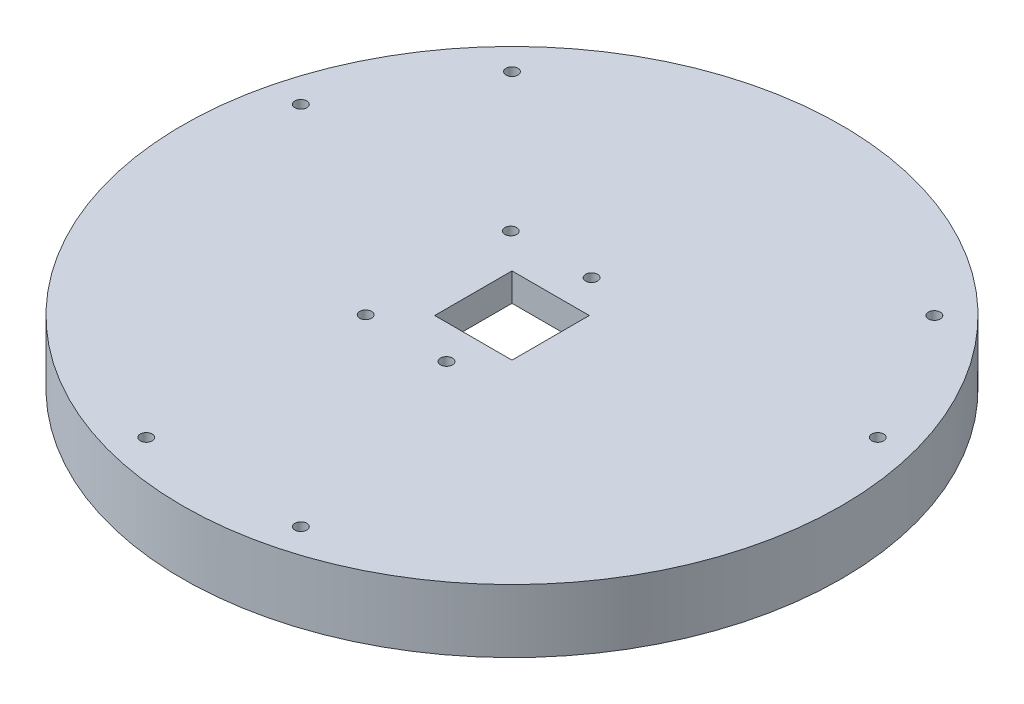
ISO-10303-21;
HEADER;
FILE_DESCRIPTION(('STEP AP214'),'2;1');
FILE_NAME('part.step','',(''),(''),'','','');
FILE_SCHEMA(('AUTOMOTIVE_DESIGN { 1 0 10303 214 1 1 1 1 }'));
ENDSEC;
DATA;
#1=APPLICATION_CONTEXT('core data for automotive mechanical design processes');
#2=APPLICATION_PROTOCOL_DEFINITION('international standard','automotive_design',2000,#1);
#3=PRODUCT_CONTEXT('',#1,'mechanical');
#4=PRODUCT('Part','Part','',(#3));
#5=PRODUCT_RELATED_PRODUCT_CATEGORY('part','',(#4));
#6=PRODUCT_DEFINITION_FORMATION('','',#4);
#7=PRODUCT_DEFINITION_CONTEXT('part definition',#1,'design');
#8=PRODUCT_DEFINITION('design','',#6,#7);
#9=PRODUCT_DEFINITION_SHAPE('','',#8);
#10=(LENGTH_UNIT() NAMED_UNIT(*) SI_UNIT(.MILLI.,.METRE.));
#11=(NAMED_UNIT(*) PLANE_ANGLE_UNIT() SI_UNIT($,.RADIAN.));
#12=(NAMED_UNIT(*) SI_UNIT($,.STERADIAN.) SOLID_ANGLE_UNIT());
#13=UNCERTAINTY_MEASURE_WITH_UNIT(LENGTH_MEASURE(1.E-05),#10,'distance_accuracy_value','');
#14=(GEOMETRIC_REPRESENTATION_CONTEXT(3) GLOBAL_UNCERTAINTY_ASSIGNED_CONTEXT((#13)) GLOBAL_UNIT_ASSIGNED_CONTEXT((#10,
#11,#12)) REPRESENTATION_CONTEXT('',''));
#15=CARTESIAN_POINT('',(0.,0.,0.));
#16=DIRECTION('',(0.,0.,1.));
#17=DIRECTION('',(1.,0.,0.));
#18=AXIS2_PLACEMENT_3D('',#15,#16,#17);
#19=CARTESIAN_POINT('',(0.,5.,0.));
#20=DIRECTION('',(0.,1.,0.));
#21=DIRECTION('',(0.,0.,1.));
#22=AXIS2_PLACEMENT_3D('',#19,#20,#21);
#23=PLANE('',#22);
#24=DIRECTION('',(0.,0.,1.));
#25=VECTOR('',#24,1.);
#26=CARTESIAN_POINT('',(21.4884157050371,5.,0.));
#27=LINE('',#26,#25);
#28=CARTESIAN_POINT('',(21.4884157050371,5.,33.7379310344827));
#29=VERTEX_POINT('',#28);
#30=CARTESIAN_POINT('',(21.4884157050371,5.,39.5379310344827));
#31=VERTEX_POINT('',#30);
#32=EDGE_CURVE('E141',#29,#31,#27,.T.);
#33=ORIENTED_EDGE('',*,*,#32,.F.);
#34=CARTESIAN_POINT('',(0.,5.,0.));
#35=DIRECTION('',(0.,-1.,0.));
#36=DIRECTION('',(0.,0.,-1.));
#37=AXIS2_PLACEMENT_3D('',#34,#35,#36);
#38=CIRCLE('',#37,40.);
#39=CARTESIAN_POINT('',(17.668302265885,5.,35.8863636363636));
#40=VERTEX_POINT('',#39);
#41=EDGE_CURVE('E137',#29,#40,#38,.T.);
#42=ORIENTED_EDGE('',*,*,#41,.T.);
#43=DIRECTION('',(0.,0.,1.));
#44=VECTOR('',#43,1.);
#45=CARTESIAN_POINT('',(17.668302265885,5.,0.));
#46=LINE('',#45,#44);
#47=CARTESIAN_POINT('',(17.668302265885,5.,41.3863636363636));
#48=VERTEX_POINT('',#47);
#49=EDGE_CURVE('E67',#40,#48,#46,.T.);
#50=ORIENTED_EDGE('',*,*,#49,.T.);
#51=CARTESIAN_POINT('',(0.,5.,0.));
#52=DIRECTION('',(0.,-1.,0.));
#53=DIRECTION('',(0.,0.,-1.));
#54=AXIS2_PLACEMENT_3D('',#51,#52,#53);
#55=CIRCLE('',#54,45.);
#56=EDGE_CURVE('E564',#31,#48,#55,.T.);
#57=ORIENTED_EDGE('',*,*,#56,.F.);
#58=EDGE_LOOP('',(#33,#42,#50,#57));
#59=FACE_BOUND('',#58,.T.);
#60=CARTESIAN_POINT('',(-41.0518476172854,5.,-10.9998094168573));
#61=DIRECTION('',(0.,1.,0.));
#62=DIRECTION('',(0.,0.,1.));
#63=AXIS2_PLACEMENT_3D('',#60,#61,#62);
#64=CIRCLE('',#63,0.850000000000011);
#65=CARTESIAN_POINT('',(-41.0518476172854,5.,-10.1498094168573));
#66=VERTEX_POINT('',#65);
#67=EDGE_CURVE('E146',#66,#66,#64,.T.);
#68=ORIENTED_EDGE('',*,*,#67,.T.);
#69=EDGE_LOOP('',(#68));
#70=FACE_BOUND('',#69,.T.);
#71=CARTESIAN_POINT('',(-30.0520382004281,5.,-30.0520382004284));
#72=DIRECTION('',(0.,1.,0.));
#73=DIRECTION('',(0.,0.,1.));
#74=AXIS2_PLACEMENT_3D('',#71,#72,#73);
#75=CIRCLE('',#74,0.850000000000014);
#76=CARTESIAN_POINT('',(-30.0520382004281,5.,-29.2020382004284));
#77=VERTEX_POINT('',#76);
#78=EDGE_CURVE('E157',#77,#77,#75,.T.);
#79=ORIENTED_EDGE('',*,*,#78,.T.);
#80=EDGE_LOOP('',(#79));
#81=FACE_BOUND('',#80,.T.);
#82=CARTESIAN_POINT('',(30.0520382004285,5.,-30.052038200428));
#83=DIRECTION('',(0.,1.,0.));
#84=DIRECTION('',(0.,0.,1.));
#85=AXIS2_PLACEMENT_3D('',#82,#83,#84);
#86=CIRCLE('',#85,0.850000000000014);
#87=CARTESIAN_POINT('',(30.0520382004285,5.,-29.202038200428));
#88=VERTEX_POINT('',#87);
#89=EDGE_CURVE('E163',#88,#88,#86,.T.);
#90=ORIENTED_EDGE('',*,*,#89,.T.);
#91=EDGE_LOOP('',(#90));
#92=FACE_BOUND('',#91,.T.);
#93=CARTESIAN_POINT('',(41.0518476172855,5.,-10.9998094168567));
#94=DIRECTION('',(0.,1.,0.));
#95=DIRECTION('',(0.,0.,1.));
#96=AXIS2_PLACEMENT_3D('',#93,#94,#95);
#97=CIRCLE('',#96,0.850000000000011);
#98=CARTESIAN_POINT('',(41.0518476172855,5.,-10.1498094168567));
#99=VERTEX_POINT('',#98);
#100=EDGE_CURVE('E169',#99,#99,#97,.T.);
#101=ORIENTED_EDGE('',*,*,#100,.T.);
#102=EDGE_LOOP('',(#101));
#103=FACE_BOUND('',#102,.T.);
#104=CARTESIAN_POINT('',(10.9998094168572,5.,41.0518476172854));
#105=DIRECTION('',(0.,1.,0.));
#106=DIRECTION('',(0.,0.,1.));
#107=AXIS2_PLACEMENT_3D('',#104,#105,#106);
#108=CIRCLE('',#107,0.850000000000013);
#109=CARTESIAN_POINT('',(10.9998094168572,5.,41.9018476172854));
#110=VERTEX_POINT('',#109);
#111=EDGE_CURVE('E175',#110,#110,#108,.T.);
#112=ORIENTED_EDGE('',*,*,#111,.T.);
#113=EDGE_LOOP('',(#112));
#114=FACE_BOUND('',#113,.T.);
#115=CARTESIAN_POINT('',(-10.9998094168572,5.,41.0518476172854));
#116=DIRECTION('',(0.,1.,0.));
#117=DIRECTION('',(0.,0.,1.));
#118=AXIS2_PLACEMENT_3D('',#115,#116,#117);
#119=CIRCLE('',#118,0.850000000000013);
#120=CARTESIAN_POINT('',(-10.9998094168572,5.,41.9018476172854));
#121=VERTEX_POINT('',#120);
#122=EDGE_CURVE('E181',#121,#121,#119,.T.);
#123=ORIENTED_EDGE('',*,*,#122,.T.);
#124=EDGE_LOOP('',(#123));
#125=FACE_BOUND('',#124,.T.);
#126=CARTESIAN_POINT('',(0.999999999999999,5.,-10.3260869565217));
#127=DIRECTION('',(0.,-1.,0.));
#128=DIRECTION('',(0.,0.,-1.));
#129=AXIS2_PLACEMENT_3D('',#126,#127,#128);
#130=CIRCLE('',#129,0.850000000000013);
#131=CARTESIAN_POINT('',(0.999999999999999,5.,-11.1760869565218));
#132=VERTEX_POINT('',#131);
#133=EDGE_CURVE('E184',#132,#132,#130,.T.);
#134=ORIENTED_EDGE('',*,*,#133,.F.);
#135=EDGE_LOOP('',(#134));
#136=FACE_BOUND('',#135,.T.);
#137=CARTESIAN_POINT('',(-10.5,5.,-10.3260869565217));
#138=DIRECTION('',(0.,-1.,0.));
#139=DIRECTION('',(0.,0.,-1.));
#140=AXIS2_PLACEMENT_3D('',#137,#138,#139);
#141=CIRCLE('',#140,0.850000000000014);
#142=CARTESIAN_POINT('',(-10.5,5.,-11.1760869565218));
#143=VERTEX_POINT('',#142);
#144=EDGE_CURVE('E190',#143,#143,#141,.T.);
#145=ORIENTED_EDGE('',*,*,#144,.F.);
#146=EDGE_LOOP('',(#145));
#147=FACE_BOUND('',#146,.T.);
#148=CARTESIAN_POINT('',(-10.5,5.,10.3260869565217));
#149=DIRECTION('',(0.,-1.,0.));
#150=DIRECTION('',(0.,0.,-1.));
#151=AXIS2_PLACEMENT_3D('',#148,#149,#150);
#152=CIRCLE('',#151,0.850000000000014);
#153=CARTESIAN_POINT('',(-10.5,5.,9.47608695652172));
#154=VERTEX_POINT('',#153);
#155=EDGE_CURVE('E196',#154,#154,#152,.T.);
#156=ORIENTED_EDGE('',*,*,#155,.F.);
#157=EDGE_LOOP('',(#156));
#158=FACE_BOUND('',#157,.T.);
#159=CARTESIAN_POINT('',(0.999999999999996,5.,10.3260869565217));
#160=DIRECTION('',(0.,-1.,0.));
#161=DIRECTION('',(0.,0.,-1.));
#162=AXIS2_PLACEMENT_3D('',#159,#160,#161);
#163=CIRCLE('',#162,0.850000000000013);
#164=CARTESIAN_POINT('',(0.999999999999996,5.,9.47608695652172));
#165=VERTEX_POINT('',#164);
#166=EDGE_CURVE('E200',#165,#165,#163,.T.);
#167=ORIENTED_EDGE('',*,*,#166,.F.);
#168=EDGE_LOOP('',(#167));
#169=FACE_BOUND('',#168,.T.);
#170=CARTESIAN_POINT('',(0.,5.,0.));
#171=DIRECTION('',(0.,1.,0.));
#172=DIRECTION('',(1.,0.,0.));
#173=AXIS2_PLACEMENT_3D('',#170,#171,#172);
#174=CIRCLE('',#173,45.1);
#175=CARTESIAN_POINT('',(45.1,5.,0.));
#176=VERTEX_POINT('',#175);
#177=EDGE_CURVE('E235',#176,#176,#174,.T.);
#178=ORIENTED_EDGE('',*,*,#177,.F.);
#179=EDGE_LOOP('',(#178));
#180=FACE_BOUND('',#179,.T.);
#181=DIRECTION('',(0.,0.,-1.));
#182=VECTOR('',#181,1.);
#183=CARTESIAN_POINT('',(5.5,5.,0.));
#184=LINE('',#183,#182);
#185=CARTESIAN_POINT('',(5.5,5.,5.5));
#186=VERTEX_POINT('',#185);
#187=CARTESIAN_POINT('',(5.5,5.,-5.5));
#188=VERTEX_POINT('',#187);
#189=EDGE_CURVE('E75',#186,#188,#184,.T.);
#190=ORIENTED_EDGE('',*,*,#189,.T.);
#191=DIRECTION('',(1.,0.,0.));
#192=VECTOR('',#191,1.);
#193=CARTESIAN_POINT('',(0.,5.,-5.5));
#194=LINE('',#193,#192);
#195=CARTESIAN_POINT('',(-5.5,5.,-5.5));
#196=VERTEX_POINT('',#195);
#197=EDGE_CURVE('E207',#196,#188,#194,.T.);
#198=ORIENTED_EDGE('',*,*,#197,.F.);
#199=DIRECTION('',(0.,0.,-1.));
#200=VECTOR('',#199,1.);
#201=CARTESIAN_POINT('',(-5.5,5.,0.));
#202=LINE('',#201,#200);
#203=CARTESIAN_POINT('',(-5.5,5.,5.5));
#204=VERTEX_POINT('',#203);
#205=EDGE_CURVE('E220',#204,#196,#202,.T.);
#206=ORIENTED_EDGE('',*,*,#205,.F.);
#207=DIRECTION('',(1.,0.,0.));
#208=VECTOR('',#207,1.);
#209=CARTESIAN_POINT('',(0.,5.,5.5));
#210=LINE('',#209,#208);
#211=EDGE_CURVE('E217',#204,#186,#210,.T.);
#212=ORIENTED_EDGE('',*,*,#211,.T.);
#213=EDGE_LOOP('',(#190,#198,#206,#212));
#214=FACE_BOUND('',#213,.T.);
#215=ADVANCED_FACE('F51',(#59,#70,#81,#92,#103,#114,#125,#136,#147,#158,#169,#180,#214),#23,.F.);
#216=CARTESIAN_POINT('',(0.,9.,0.));
#217=DIRECTION('',(0.,1.,0.));
#218=DIRECTION('',(0.,0.,1.));
#219=AXIS2_PLACEMENT_3D('',#216,#217,#218);
#220=PLANE('',#219);
#221=CARTESIAN_POINT('',(-41.0518476172854,9.,-10.9998094168573));
#222=DIRECTION('',(0.,1.,0.));
#223=DIRECTION('',(0.,0.,1.));
#224=AXIS2_PLACEMENT_3D('',#221,#222,#223);
#225=CIRCLE('',#224,0.850000000000011);
#226=CARTESIAN_POINT('',(-41.0518476172854,9.,-10.1498094168573));
#227=VERTEX_POINT('',#226);
#228=EDGE_CURVE('E143',#227,#227,#225,.T.);
#229=ORIENTED_EDGE('',*,*,#228,.F.);
#230=EDGE_LOOP('',(#229));
#231=FACE_BOUND('',#230,.T.);
#232=CARTESIAN_POINT('',(-30.0520382004281,9.,-30.0520382004284));
#233=DIRECTION('',(0.,1.,0.));
#234=DIRECTION('',(0.,0.,1.));
#235=AXIS2_PLACEMENT_3D('',#232,#233,#234);
#236=CIRCLE('',#235,0.850000000000014);
#237=CARTESIAN_POINT('',(-30.0520382004281,9.,-29.2020382004284));
#238=VERTEX_POINT('',#237);
#239=EDGE_CURVE('E154',#238,#238,#236,.T.);
#240=ORIENTED_EDGE('',*,*,#239,.F.);
#241=EDGE_LOOP('',(#240));
#242=FACE_BOUND('',#241,.T.);
#243=CARTESIAN_POINT('',(30.0520382004285,9.,-30.052038200428));
#244=DIRECTION('',(0.,1.,0.));
#245=DIRECTION('',(0.,0.,1.));
#246=AXIS2_PLACEMENT_3D('',#243,#244,#245);
#247=CIRCLE('',#246,0.850000000000014);
#248=CARTESIAN_POINT('',(30.0520382004285,9.,-29.202038200428));
#249=VERTEX_POINT('',#248);
#250=EDGE_CURVE('E160',#249,#249,#247,.T.);
#251=ORIENTED_EDGE('',*,*,#250,.F.);
#252=EDGE_LOOP('',(#251));
#253=FACE_BOUND('',#252,.T.);
#254=CARTESIAN_POINT('',(41.0518476172855,9.,-10.9998094168567));
#255=DIRECTION('',(0.,1.,0.));
#256=DIRECTION('',(0.,0.,1.));
#257=AXIS2_PLACEMENT_3D('',#254,#255,#256);
#258=CIRCLE('',#257,0.850000000000011);
#259=CARTESIAN_POINT('',(41.0518476172855,9.,-10.1498094168567));
#260=VERTEX_POINT('',#259);
#261=EDGE_CURVE('E166',#260,#260,#258,.T.);
#262=ORIENTED_EDGE('',*,*,#261,.F.);
#263=EDGE_LOOP('',(#262));
#264=FACE_BOUND('',#263,.T.);
#265=CARTESIAN_POINT('',(10.9998094168572,9.,41.0518476172854));
#266=DIRECTION('',(0.,1.,0.));
#267=DIRECTION('',(0.,0.,1.));
#268=AXIS2_PLACEMENT_3D('',#265,#266,#267);
#269=CIRCLE('',#268,0.850000000000014);
#270=CARTESIAN_POINT('',(10.9998094168572,9.,41.9018476172854));
#271=VERTEX_POINT('',#270);
#272=EDGE_CURVE('E172',#271,#271,#269,.T.);
#273=ORIENTED_EDGE('',*,*,#272,.F.);
#274=EDGE_LOOP('',(#273));
#275=FACE_BOUND('',#274,.T.);
#276=CARTESIAN_POINT('',(-10.9998094168572,9.,41.0518476172854));
#277=DIRECTION('',(0.,1.,0.));
#278=DIRECTION('',(0.,0.,1.));
#279=AXIS2_PLACEMENT_3D('',#276,#277,#278);
#280=CIRCLE('',#279,0.850000000000014);
#281=CARTESIAN_POINT('',(-10.9998094168572,9.,41.9018476172854));
#282=VERTEX_POINT('',#281);
#283=EDGE_CURVE('E178',#282,#282,#280,.T.);
#284=ORIENTED_EDGE('',*,*,#283,.F.);
#285=EDGE_LOOP('',(#284));
#286=FACE_BOUND('',#285,.T.);
#287=CARTESIAN_POINT('',(0.999999999999999,9.,-10.3260869565217));
#288=DIRECTION('',(0.,1.,0.));
#289=DIRECTION('',(0.,0.,1.));
#290=AXIS2_PLACEMENT_3D('',#287,#288,#289);
#291=CIRCLE('',#290,0.850000000000013);
#292=CARTESIAN_POINT('',(0.999999999999999,9.,-9.47608695652173));
#293=VERTEX_POINT('',#292);
#294=EDGE_CURVE('E187',#293,#293,#291,.T.);
#295=ORIENTED_EDGE('',*,*,#294,.F.);
#296=EDGE_LOOP('',(#295));
#297=FACE_BOUND('',#296,.T.);
#298=CARTESIAN_POINT('',(-10.5,9.,-10.3260869565217));
#299=DIRECTION('',(0.,1.,0.));
#300=DIRECTION('',(0.,0.,1.));
#301=AXIS2_PLACEMENT_3D('',#298,#299,#300);
#302=CIRCLE('',#301,0.850000000000013);
#303=CARTESIAN_POINT('',(-10.5,9.,-9.47608695652173));
#304=VERTEX_POINT('',#303);
#305=EDGE_CURVE('E193',#304,#304,#302,.T.);
#306=ORIENTED_EDGE('',*,*,#305,.F.);
#307=EDGE_LOOP('',(#306));
#308=FACE_BOUND('',#307,.T.);
#309=CARTESIAN_POINT('',(-10.5,9.,10.3260869565217));
#310=DIRECTION('',(0.,1.,0.));
#311=DIRECTION('',(0.,0.,1.));
#312=AXIS2_PLACEMENT_3D('',#309,#310,#311);
#313=CIRCLE('',#312,0.850000000000013);
#314=CARTESIAN_POINT('',(-10.5,9.,11.1760869565217));
#315=VERTEX_POINT('',#314);
#316=EDGE_CURVE('E199',#315,#315,#313,.T.);
#317=ORIENTED_EDGE('',*,*,#316,.F.);
#318=EDGE_LOOP('',(#317));
#319=FACE_BOUND('',#318,.T.);
#320=CARTESIAN_POINT('',(0.999999999999996,9.,10.3260869565217));
#321=DIRECTION('',(0.,1.,0.));
#322=DIRECTION('',(0.,0.,1.));
#323=AXIS2_PLACEMENT_3D('',#320,#321,#322);
#324=CIRCLE('',#323,0.850000000000013);
#325=CARTESIAN_POINT('',(0.999999999999996,9.,11.1760869565217));
#326=VERTEX_POINT('',#325);
#327=EDGE_CURVE('E203',#326,#326,#324,.T.);
#328=ORIENTED_EDGE('',*,*,#327,.F.);
#329=EDGE_LOOP('',(#328));
#330=FACE_BOUND('',#329,.T.);
#331=CARTESIAN_POINT('',(0.,9.,0.));
#332=DIRECTION('',(0.,1.,0.));
#333=DIRECTION('',(0.,0.,1.));
#334=AXIS2_PLACEMENT_3D('',#331,#332,#333);
#335=CIRCLE('',#334,46.9);
#336=CARTESIAN_POINT('',(0.,9.,46.9));
#337=VERTEX_POINT('',#336);
#338=EDGE_CURVE('E227',#337,#337,#335,.T.);
#339=ORIENTED_EDGE('',*,*,#338,.T.);
#340=EDGE_LOOP('',(#339));
#341=FACE_BOUND('',#340,.T.);
#342=DIRECTION('',(1.,0.,0.));
#343=VECTOR('',#342,1.);
#344=CARTESIAN_POINT('',(0.,9.,-5.5));
#345=LINE('',#344,#343);
#346=CARTESIAN_POINT('',(-5.5,9.,-5.5));
#347=VERTEX_POINT('',#346);
#348=CARTESIAN_POINT('',(5.5,9.,-5.5));
#349=VERTEX_POINT('',#348);
#350=EDGE_CURVE('E212',#347,#349,#345,.T.);
#351=ORIENTED_EDGE('',*,*,#350,.T.);
#352=DIRECTION('',(0.,0.,-1.));
#353=VECTOR('',#352,1.);
#354=CARTESIAN_POINT('',(5.5,9.,0.));
#355=LINE('',#354,#353);
#356=CARTESIAN_POINT('',(5.5,9.,5.5));
#357=VERTEX_POINT('',#356);
#358=EDGE_CURVE('E204',#357,#349,#355,.T.);
#359=ORIENTED_EDGE('',*,*,#358,.F.);
#360=DIRECTION('',(1.,0.,0.));
#361=VECTOR('',#360,1.);
#362=CARTESIAN_POINT('',(0.,9.,5.5));
#363=LINE('',#362,#361);
#364=CARTESIAN_POINT('',(-5.5,9.,5.5));
#365=VERTEX_POINT('',#364);
#366=EDGE_CURVE('E206',#365,#357,#363,.T.);
#367=ORIENTED_EDGE('',*,*,#366,.F.);
#368=DIRECTION('',(0.,0.,-1.));
#369=VECTOR('',#368,1.);
#370=CARTESIAN_POINT('',(-5.5,9.,0.));
#371=LINE('',#370,#369);
#372=EDGE_CURVE('E209',#365,#347,#371,.T.);
#373=ORIENTED_EDGE('',*,*,#372,.T.);
#374=EDGE_LOOP('',(#351,#359,#367,#373));
#375=FACE_BOUND('',#374,.T.);
#376=ADVANCED_FACE('F266',(#231,#242,#253,#264,#275,#286,#297,#308,#319,#330,#341,#375),#220,.T.);
#377=CARTESIAN_POINT('',(0.,0.,0.));
#378=DIRECTION('',(0.,1.,0.));
#379=DIRECTION('',(0.,0.,1.));
#380=AXIS2_PLACEMENT_3D('',#377,#378,#379);
#381=PLANE('',#380);
#382=CARTESIAN_POINT('',(0.,0.,0.));
#383=DIRECTION('',(0.,1.,0.));
#384=DIRECTION('',(0.,0.,1.));
#385=AXIS2_PLACEMENT_3D('',#382,#383,#384);
#386=CIRCLE('',#385,45.4);
#387=CARTESIAN_POINT('',(0.,0.,45.4));
#388=VERTEX_POINT('',#387);
#389=EDGE_CURVE('E60',#388,#388,#386,.T.);
#390=ORIENTED_EDGE('',*,*,#389,.T.);
#391=EDGE_LOOP('',(#390));
#392=FACE_BOUND('',#391,.T.);
#393=CARTESIAN_POINT('',(0.,0.,0.));
#394=DIRECTION('',(0.,1.,0.));
#395=DIRECTION('',(1.,0.,0.));
#396=AXIS2_PLACEMENT_3D('',#393,#394,#395);
#397=CIRCLE('',#396,46.9);
#398=CARTESIAN_POINT('',(46.9,0.,0.));
#399=VERTEX_POINT('',#398);
#400=EDGE_CURVE('E238',#399,#399,#397,.T.);
#401=ORIENTED_EDGE('',*,*,#400,.F.);
#402=EDGE_LOOP('',(#401));
#403=FACE_BOUND('',#402,.T.);
#404=ADVANCED_FACE('F247',(#392,#403),#381,.F.);
#405=CARTESIAN_POINT('',(0.,5.,0.));
#406=DIRECTION('',(0.,-1.,0.));
#407=DIRECTION('',(0.,0.,-1.));
#408=AXIS2_PLACEMENT_3D('',#405,#406,#407);
#409=CYLINDRICAL_SURFACE('',#408,46.9);
#410=ORIENTED_EDGE('',*,*,#400,.T.);
#411=EDGE_LOOP('',(#410));
#412=FACE_BOUND('',#411,.T.);
#413=ORIENTED_EDGE('',*,*,#338,.F.);
#414=EDGE_LOOP('',(#413));
#415=FACE_BOUND('',#414,.T.);
#416=ADVANCED_FACE('F281',(#412,#415),#409,.T.);
#417=CARTESIAN_POINT('',(0.,5.,0.));
#418=DIRECTION('',(0.,-1.,0.));
#419=DIRECTION('',(0.,0.,-1.));
#420=AXIS2_PLACEMENT_3D('',#417,#418,#419);
#421=CYLINDRICAL_SURFACE('',#420,45.1);
#422=CARTESIAN_POINT('',(0.,0.299999999999995,0.));
#423=DIRECTION('',(0.,1.,0.));
#424=DIRECTION('',(0.,0.,1.));
#425=AXIS2_PLACEMENT_3D('',#422,#423,#424);
#426=CIRCLE('',#425,45.1);
#427=CARTESIAN_POINT('',(0.,0.299999999999995,45.1));
#428=VERTEX_POINT('',#427);
#429=EDGE_CURVE('E12',#428,#428,#426,.F.);
#430=ORIENTED_EDGE('',*,*,#429,.T.);
#431=EDGE_LOOP('',(#430));
#432=FACE_BOUND('',#431,.T.);
#433=ORIENTED_EDGE('',*,*,#177,.T.);
#434=EDGE_LOOP('',(#433));
#435=FACE_BOUND('',#434,.T.);
#436=ADVANCED_FACE('F277',(#432,#435),#421,.F.);
#437=CARTESIAN_POINT('',(5.5,9.,0.));
#438=DIRECTION('',(-1.,0.,0.));
#439=DIRECTION('',(0.,0.,1.));
#440=AXIS2_PLACEMENT_3D('',#437,#438,#439);
#441=PLANE('',#440);
#442=ORIENTED_EDGE('',*,*,#189,.F.);
#443=DIRECTION('',(0.,-1.,0.));
#444=VECTOR('',#443,1.);
#445=CARTESIAN_POINT('',(5.5,9.,5.5));
#446=LINE('',#445,#444);
#447=EDGE_CURVE('E215',#357,#186,#446,.T.);
#448=ORIENTED_EDGE('',*,*,#447,.F.);
#449=ORIENTED_EDGE('',*,*,#358,.T.);
#450=DIRECTION('',(0.,-1.,0.));
#451=VECTOR('',#450,1.);
#452=CARTESIAN_POINT('',(5.5,9.,-5.5));
#453=LINE('',#452,#451);
#454=EDGE_CURVE('E225',#349,#188,#453,.T.);
#455=ORIENTED_EDGE('',*,*,#454,.T.);
#456=EDGE_LOOP('',(#442,#448,#449,#455));
#457=FACE_BOUND('',#456,.T.);
#458=ADVANCED_FACE('F280',(#457),#441,.T.);
#459=CARTESIAN_POINT('',(0.,9.,-5.5));
#460=DIRECTION('',(0.,0.,-1.));
#461=DIRECTION('',(-1.,0.,0.));
#462=AXIS2_PLACEMENT_3D('',#459,#460,#461);
#463=PLANE('',#462);
#464=ORIENTED_EDGE('',*,*,#197,.T.);
#465=ORIENTED_EDGE('',*,*,#454,.F.);
#466=ORIENTED_EDGE('',*,*,#350,.F.);
#467=DIRECTION('',(0.,-1.,0.));
#468=VECTOR('',#467,1.);
#469=CARTESIAN_POINT('',(-5.5,9.,-5.5));
#470=LINE('',#469,#468);
#471=EDGE_CURVE('E228',#347,#196,#470,.T.);
#472=ORIENTED_EDGE('',*,*,#471,.T.);
#473=EDGE_LOOP('',(#464,#465,#466,#472));
#474=FACE_BOUND('',#473,.T.);
#475=ADVANCED_FACE('F298',(#474),#463,.F.);
#476=CARTESIAN_POINT('',(-5.5,9.,0.));
#477=DIRECTION('',(-1.,0.,0.));
#478=DIRECTION('',(0.,0.,1.));
#479=AXIS2_PLACEMENT_3D('',#476,#477,#478);
#480=PLANE('',#479);
#481=ORIENTED_EDGE('',*,*,#205,.T.);
#482=ORIENTED_EDGE('',*,*,#471,.F.);
#483=ORIENTED_EDGE('',*,*,#372,.F.);
#484=DIRECTION('',(0.,-1.,0.));
#485=VECTOR('',#484,1.);
#486=CARTESIAN_POINT('',(-5.5,9.,5.5));
#487=LINE('',#486,#485);
#488=EDGE_CURVE('E230',#365,#204,#487,.T.);
#489=ORIENTED_EDGE('',*,*,#488,.T.);
#490=EDGE_LOOP('',(#481,#482,#483,#489));
#491=FACE_BOUND('',#490,.T.);
#492=ADVANCED_FACE('F307',(#491),#480,.F.);
#493=CARTESIAN_POINT('',(0.,9.,5.5));
#494=DIRECTION('',(0.,0.,-1.));
#495=DIRECTION('',(-1.,0.,0.));
#496=AXIS2_PLACEMENT_3D('',#493,#494,#495);
#497=PLANE('',#496);
#498=ORIENTED_EDGE('',*,*,#211,.F.);
#499=ORIENTED_EDGE('',*,*,#488,.F.);
#500=ORIENTED_EDGE('',*,*,#366,.T.);
#501=ORIENTED_EDGE('',*,*,#447,.T.);
#502=EDGE_LOOP('',(#498,#499,#500,#501));
#503=FACE_BOUND('',#502,.T.);
#504=ADVANCED_FACE('F302',(#503),#497,.T.);
#505=CARTESIAN_POINT('',(0.999999999999996,5.,10.3260869565217));
#506=DIRECTION('',(0.,-1.,0.));
#507=DIRECTION('',(0.,0.,-1.));
#508=AXIS2_PLACEMENT_3D('',#505,#506,#507);
#509=CYLINDRICAL_SURFACE('',#508,0.850000000000013);
#510=ORIENTED_EDGE('',*,*,#327,.T.);
#511=EDGE_LOOP('',(#510));
#512=FACE_BOUND('',#511,.T.);
#513=ORIENTED_EDGE('',*,*,#166,.T.);
#514=EDGE_LOOP('',(#513));
#515=FACE_BOUND('',#514,.T.);
#516=ADVANCED_FACE('F314',(#512,#515),#509,.F.);
#517=CARTESIAN_POINT('',(-10.5,5.,10.3260869565217));
#518=DIRECTION('',(0.,-1.,0.));
#519=DIRECTION('',(0.,0.,-1.));
#520=AXIS2_PLACEMENT_3D('',#517,#518,#519);
#521=CYLINDRICAL_SURFACE('',#520,0.850000000000013);
#522=ORIENTED_EDGE('',*,*,#316,.T.);
#523=EDGE_LOOP('',(#522));
#524=FACE_BOUND('',#523,.T.);
#525=ORIENTED_EDGE('',*,*,#155,.T.);
#526=EDGE_LOOP('',(#525));
#527=FACE_BOUND('',#526,.T.);
#528=ADVANCED_FACE('F350',(#524,#527),#521,.F.);
#529=CARTESIAN_POINT('',(-10.5,5.,-10.3260869565217));
#530=DIRECTION('',(0.,-1.,0.));
#531=DIRECTION('',(0.,0.,-1.));
#532=AXIS2_PLACEMENT_3D('',#529,#530,#531);
#533=CYLINDRICAL_SURFACE('',#532,0.850000000000013);
#534=ORIENTED_EDGE('',*,*,#305,.T.);
#535=EDGE_LOOP('',(#534));
#536=FACE_BOUND('',#535,.T.);
#537=ORIENTED_EDGE('',*,*,#144,.T.);
#538=EDGE_LOOP('',(#537));
#539=FACE_BOUND('',#538,.T.);
#540=ADVANCED_FACE('F261',(#536,#539),#533,.F.);
#541=CARTESIAN_POINT('',(0.999999999999999,5.,-10.3260869565217));
#542=DIRECTION('',(0.,-1.,0.));
#543=DIRECTION('',(0.,0.,-1.));
#544=AXIS2_PLACEMENT_3D('',#541,#542,#543);
#545=CYLINDRICAL_SURFACE('',#544,0.850000000000013);
#546=ORIENTED_EDGE('',*,*,#294,.T.);
#547=EDGE_LOOP('',(#546));
#548=FACE_BOUND('',#547,.T.);
#549=ORIENTED_EDGE('',*,*,#133,.T.);
#550=EDGE_LOOP('',(#549));
#551=FACE_BOUND('',#550,.T.);
#552=ADVANCED_FACE('F252',(#548,#551),#545,.F.);
#553=CARTESIAN_POINT('',(0.,0.,0.));
#554=DIRECTION('',(0.,-1.,0.));
#555=DIRECTION('',(0.,0.,-1.));
#556=AXIS2_PLACEMENT_3D('',#553,#554,#555);
#557=CONICAL_SURFACE('',#556,45.4,0.785398163397437);
#558=ORIENTED_EDGE('',*,*,#429,.F.);
#559=EDGE_LOOP('',(#558));
#560=FACE_BOUND('',#559,.T.);
#561=ORIENTED_EDGE('',*,*,#389,.F.);
#562=EDGE_LOOP('',(#561));
#563=FACE_BOUND('',#562,.T.);
#564=ADVANCED_FACE('F54',(#560,#563),#557,.F.);
#565=CARTESIAN_POINT('',(-10.9998094168572,9.,41.0518476172854));
#566=DIRECTION('',(0.,1.,0.));
#567=DIRECTION('',(0.,0.,1.));
#568=AXIS2_PLACEMENT_3D('',#565,#566,#567);
#569=CYLINDRICAL_SURFACE('',#568,0.850000000000013);
#570=ORIENTED_EDGE('',*,*,#122,.F.);
#571=EDGE_LOOP('',(#570));
#572=FACE_BOUND('',#571,.T.);
#573=ORIENTED_EDGE('',*,*,#283,.T.);
#574=EDGE_LOOP('',(#573));
#575=FACE_BOUND('',#574,.T.);
#576=ADVANCED_FACE('F251',(#572,#575),#569,.F.);
#577=CARTESIAN_POINT('',(10.9998094168572,9.,41.0518476172854));
#578=DIRECTION('',(0.,1.,0.));
#579=DIRECTION('',(0.,0.,1.));
#580=AXIS2_PLACEMENT_3D('',#577,#578,#579);
#581=CYLINDRICAL_SURFACE('',#580,0.850000000000013);
#582=ORIENTED_EDGE('',*,*,#111,.F.);
#583=EDGE_LOOP('',(#582));
#584=FACE_BOUND('',#583,.T.);
#585=ORIENTED_EDGE('',*,*,#272,.T.);
#586=EDGE_LOOP('',(#585));
#587=FACE_BOUND('',#586,.T.);
#588=ADVANCED_FACE('F258',(#584,#587),#581,.F.);
#589=CARTESIAN_POINT('',(41.0518476172855,9.,-10.9998094168567));
#590=DIRECTION('',(0.,1.,0.));
#591=DIRECTION('',(0.,0.,1.));
#592=AXIS2_PLACEMENT_3D('',#589,#590,#591);
#593=CYLINDRICAL_SURFACE('',#592,0.850000000000011);
#594=ORIENTED_EDGE('',*,*,#100,.F.);
#595=EDGE_LOOP('',(#594));
#596=FACE_BOUND('',#595,.T.);
#597=ORIENTED_EDGE('',*,*,#261,.T.);
#598=EDGE_LOOP('',(#597));
#599=FACE_BOUND('',#598,.T.);
#600=ADVANCED_FACE('F424',(#596,#599),#593,.F.);
#601=CARTESIAN_POINT('',(30.0520382004285,9.,-30.052038200428));
#602=DIRECTION('',(0.,1.,0.));
#603=DIRECTION('',(0.,0.,1.));
#604=AXIS2_PLACEMENT_3D('',#601,#602,#603);
#605=CYLINDRICAL_SURFACE('',#604,0.850000000000014);
#606=ORIENTED_EDGE('',*,*,#89,.F.);
#607=EDGE_LOOP('',(#606));
#608=FACE_BOUND('',#607,.T.);
#609=ORIENTED_EDGE('',*,*,#250,.T.);
#610=EDGE_LOOP('',(#609));
#611=FACE_BOUND('',#610,.T.);
#612=ADVANCED_FACE('F435',(#608,#611),#605,.F.);
#613=CARTESIAN_POINT('',(-30.0520382004281,9.,-30.0520382004284));
#614=DIRECTION('',(0.,1.,0.));
#615=DIRECTION('',(0.,0.,1.));
#616=AXIS2_PLACEMENT_3D('',#613,#614,#615);
#617=CYLINDRICAL_SURFACE('',#616,0.850000000000014);
#618=ORIENTED_EDGE('',*,*,#78,.F.);
#619=EDGE_LOOP('',(#618));
#620=FACE_BOUND('',#619,.T.);
#621=ORIENTED_EDGE('',*,*,#239,.T.);
#622=EDGE_LOOP('',(#621));
#623=FACE_BOUND('',#622,.T.);
#624=ADVANCED_FACE('F446',(#620,#623),#617,.F.);
#625=CARTESIAN_POINT('',(-41.0518476172854,9.,-10.9998094168573));
#626=DIRECTION('',(0.,1.,0.));
#627=DIRECTION('',(0.,0.,1.));
#628=AXIS2_PLACEMENT_3D('',#625,#626,#627);
#629=CYLINDRICAL_SURFACE('',#628,0.850000000000011);
#630=ORIENTED_EDGE('',*,*,#67,.F.);
#631=EDGE_LOOP('',(#630));
#632=FACE_BOUND('',#631,.T.);
#633=ORIENTED_EDGE('',*,*,#228,.T.);
#634=EDGE_LOOP('',(#633));
#635=FACE_BOUND('',#634,.T.);
#636=ADVANCED_FACE('F457',(#632,#635),#629,.F.);
#637=CARTESIAN_POINT('',(21.4884157050371,1.,0.));
#638=DIRECTION('',(-1.,0.,0.));
#639=DIRECTION('',(0.,0.,1.));
#640=AXIS2_PLACEMENT_3D('',#637,#638,#639);
#641=PLANE('',#640);
#642=ORIENTED_EDGE('',*,*,#32,.T.);
#643=DIRECTION('',(0.,1.,0.));
#644=VECTOR('',#643,1.);
#645=CARTESIAN_POINT('',(21.4884157050371,1.,39.5379310344827));
#646=LINE('',#645,#644);
#647=CARTESIAN_POINT('',(21.4884157050371,1.,39.5379310344827));
#648=VERTEX_POINT('',#647);
#649=EDGE_CURVE('E122',#648,#31,#646,.T.);
#650=ORIENTED_EDGE('',*,*,#649,.F.);
#651=DIRECTION('',(0.,0.,1.));
#652=VECTOR('',#651,1.);
#653=CARTESIAN_POINT('',(21.4884157050371,1.,0.));
#654=LINE('',#653,#652);
#655=CARTESIAN_POINT('',(21.4884157050371,1.,33.7379310344827));
#656=VERTEX_POINT('',#655);
#657=EDGE_CURVE('E129',#656,#648,#654,.T.);
#658=ORIENTED_EDGE('',*,*,#657,.F.);
#659=DIRECTION('',(0.,1.,0.));
#660=VECTOR('',#659,1.);
#661=CARTESIAN_POINT('',(21.4884157050371,1.,33.7379310344827));
#662=LINE('',#661,#660);
#663=EDGE_CURVE('E562',#656,#29,#662,.T.);
#664=ORIENTED_EDGE('',*,*,#663,.T.);
#665=EDGE_LOOP('',(#642,#650,#658,#664));
#666=FACE_BOUND('',#665,.T.);
#667=ADVANCED_FACE('F139',(#666),#641,.F.);
#668=CARTESIAN_POINT('',(0.,1.,0.));
#669=DIRECTION('',(0.,1.,0.));
#670=DIRECTION('',(0.,0.,1.));
#671=AXIS2_PLACEMENT_3D('',#668,#669,#670);
#672=CYLINDRICAL_SURFACE('',#671,45.);
#673=ORIENTED_EDGE('',*,*,#56,.T.);
#674=DIRECTION('',(0.,1.,0.));
#675=VECTOR('',#674,1.);
#676=CARTESIAN_POINT('',(17.668302265885,1.,41.3863636363636));
#677=LINE('',#676,#675);
#678=CARTESIAN_POINT('',(17.668302265885,1.,41.3863636363636));
#679=VERTEX_POINT('',#678);
#680=EDGE_CURVE('E124',#679,#48,#677,.T.);
#681=ORIENTED_EDGE('',*,*,#680,.F.);
#682=CARTESIAN_POINT('',(0.,1.,0.));
#683=DIRECTION('',(0.,-1.,0.));
#684=DIRECTION('',(0.,0.,-1.));
#685=AXIS2_PLACEMENT_3D('',#682,#683,#684);
#686=CIRCLE('',#685,45.);
#687=EDGE_CURVE('E117',#648,#679,#686,.T.);
#688=ORIENTED_EDGE('',*,*,#687,.F.);
#689=ORIENTED_EDGE('',*,*,#649,.T.);
#690=EDGE_LOOP('',(#673,#681,#688,#689));
#691=FACE_BOUND('',#690,.T.);
#692=ADVANCED_FACE('F120',(#691),#672,.T.);
#693=CARTESIAN_POINT('',(17.668302265885,1.,0.));
#694=DIRECTION('',(-1.,0.,0.));
#695=DIRECTION('',(0.,0.,1.));
#696=AXIS2_PLACEMENT_3D('',#693,#694,#695);
#697=PLANE('',#696);
#698=ORIENTED_EDGE('',*,*,#49,.F.);
#699=DIRECTION('',(0.,1.,0.));
#700=VECTOR('',#699,1.);
#701=CARTESIAN_POINT('',(17.668302265885,1.,35.8863636363636));
#702=LINE('',#701,#700);
#703=CARTESIAN_POINT('',(17.668302265885,1.,35.8863636363636));
#704=VERTEX_POINT('',#703);
#705=EDGE_CURVE('E148',#704,#40,#702,.T.);
#706=ORIENTED_EDGE('',*,*,#705,.F.);
#707=DIRECTION('',(0.,0.,1.));
#708=VECTOR('',#707,1.);
#709=CARTESIAN_POINT('',(17.668302265885,1.,0.));
#710=LINE('',#709,#708);
#711=EDGE_CURVE('E128',#704,#679,#710,.T.);
#712=ORIENTED_EDGE('',*,*,#711,.T.);
#713=ORIENTED_EDGE('',*,*,#680,.T.);
#714=EDGE_LOOP('',(#698,#706,#712,#713));
#715=FACE_BOUND('',#714,.T.);
#716=ADVANCED_FACE('F491',(#715),#697,.T.);
#717=CARTESIAN_POINT('',(0.,1.,0.));
#718=DIRECTION('',(0.,1.,0.));
#719=DIRECTION('',(0.,0.,1.));
#720=AXIS2_PLACEMENT_3D('',#717,#718,#719);
#721=CYLINDRICAL_SURFACE('',#720,40.);
#722=ORIENTED_EDGE('',*,*,#41,.F.);
#723=ORIENTED_EDGE('',*,*,#663,.F.);
#724=CARTESIAN_POINT('',(0.,1.,0.));
#725=DIRECTION('',(0.,-1.,0.));
#726=DIRECTION('',(0.,0.,-1.));
#727=AXIS2_PLACEMENT_3D('',#724,#725,#726);
#728=CIRCLE('',#727,40.);
#729=EDGE_CURVE('E135',#656,#704,#728,.T.);
#730=ORIENTED_EDGE('',*,*,#729,.T.);
#731=ORIENTED_EDGE('',*,*,#705,.T.);
#732=EDGE_LOOP('',(#722,#723,#730,#731));
#733=FACE_BOUND('',#732,.T.);
#734=ADVANCED_FACE('F501',(#733),#721,.F.);
#735=CARTESIAN_POINT('',(0.,1.,0.));
#736=DIRECTION('',(0.,-1.,0.));
#737=DIRECTION('',(0.,0.,-1.));
#738=AXIS2_PLACEMENT_3D('',#735,#736,#737);
#739=PLANE('',#738);
#740=ORIENTED_EDGE('',*,*,#657,.T.);
#741=ORIENTED_EDGE('',*,*,#687,.T.);
#742=ORIENTED_EDGE('',*,*,#711,.F.);
#743=ORIENTED_EDGE('',*,*,#729,.F.);
#744=EDGE_LOOP('',(#740,#741,#742,#743));
#745=FACE_BOUND('',#744,.T.);
#746=ADVANCED_FACE('F133',(#745),#739,.T.);
#747=CLOSED_SHELL('',(#215,#376,#404,#416,#436,#458,#475,#492,#504,#516,#528,#540,#552,#564,
#576,#588,#600,#612,#624,#636,#667,#692,#716,#734,#746));
#748=MANIFOLD_SOLID_BREP('B2',#747);
#749=ADVANCED_BREP_SHAPE_REPRESENTATION('',(#18,#748),#14);
#750=SHAPE_DEFINITION_REPRESENTATION(#9,#749);
ENDSEC;
END-ISO-10303-21;
